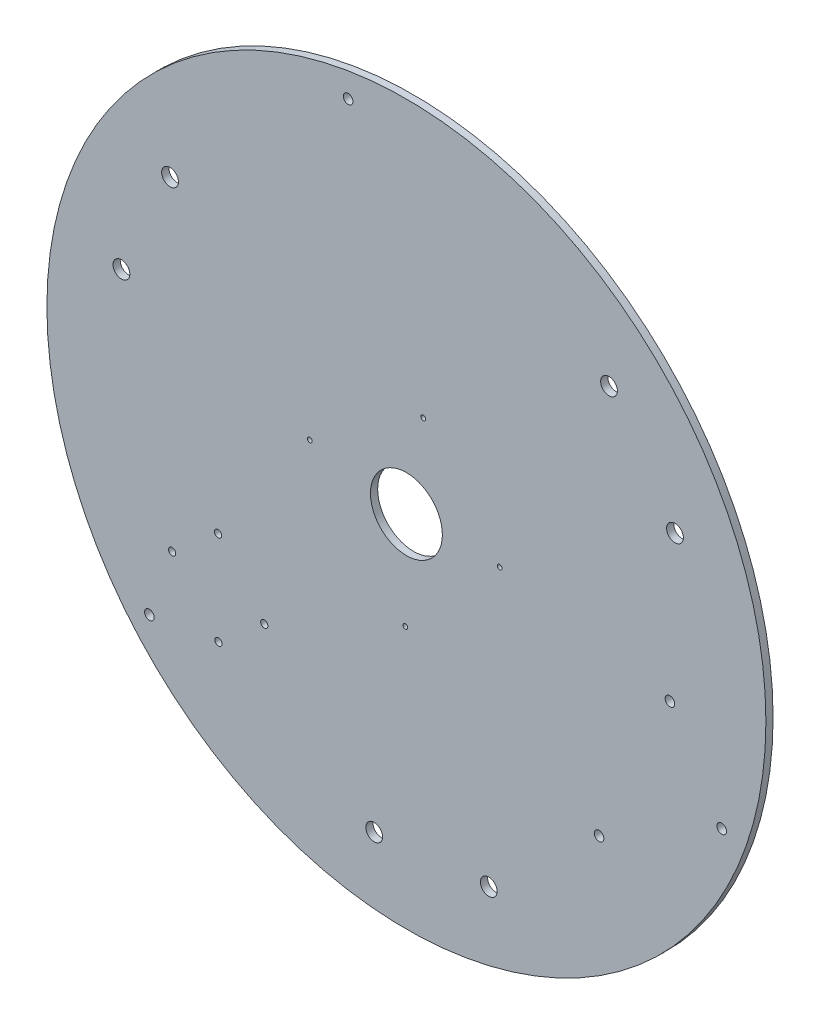
ISO-10303-21;
HEADER;
FILE_DESCRIPTION(('STEP AP214'),'2;1');
FILE_NAME('part.step','',(''),(''),'','','');
FILE_SCHEMA(('AUTOMOTIVE_DESIGN { 1 0 10303 214 1 1 1 1 }'));
ENDSEC;
DATA;
#1=APPLICATION_CONTEXT('core data for automotive mechanical design processes');
#2=APPLICATION_PROTOCOL_DEFINITION('international standard','automotive_design',2000,#1);
#3=PRODUCT_CONTEXT('',#1,'mechanical');
#4=PRODUCT('Part','Part','',(#3));
#5=PRODUCT_RELATED_PRODUCT_CATEGORY('part','',(#4));
#6=PRODUCT_DEFINITION_FORMATION('','',#4);
#7=PRODUCT_DEFINITION_CONTEXT('part definition',#1,'design');
#8=PRODUCT_DEFINITION('design','',#6,#7);
#9=PRODUCT_DEFINITION_SHAPE('','',#8);
#10=(LENGTH_UNIT() NAMED_UNIT(*) SI_UNIT(.MILLI.,.METRE.));
#11=(NAMED_UNIT(*) PLANE_ANGLE_UNIT() SI_UNIT($,.RADIAN.));
#12=(NAMED_UNIT(*) SI_UNIT($,.STERADIAN.) SOLID_ANGLE_UNIT());
#13=UNCERTAINTY_MEASURE_WITH_UNIT(LENGTH_MEASURE(1.E-05),#10,'distance_accuracy_value','');
#14=(GEOMETRIC_REPRESENTATION_CONTEXT(3) GLOBAL_UNCERTAINTY_ASSIGNED_CONTEXT((#13)) GLOBAL_UNIT_ASSIGNED_CONTEXT((#10,
#11,#12)) REPRESENTATION_CONTEXT('',''));
#15=CARTESIAN_POINT('',(0.,0.,0.));
#16=DIRECTION('',(0.,0.,1.));
#17=DIRECTION('',(1.,0.,0.));
#18=AXIS2_PLACEMENT_3D('',#15,#16,#17);
#19=CARTESIAN_POINT('',(0.,0.,3.));
#20=DIRECTION('',(0.,0.,-1.));
#21=DIRECTION('',(-1.,0.,0.));
#22=AXIS2_PLACEMENT_3D('',#19,#20,#21);
#23=CYLINDRICAL_SURFACE('',#22,150.);
#24=CARTESIAN_POINT('',(0.,0.,3.));
#25=DIRECTION('',(0.,0.,1.));
#26=DIRECTION('',(1.,0.,0.));
#27=AXIS2_PLACEMENT_3D('',#24,#25,#26);
#28=CIRCLE('',#27,150.);
#29=CARTESIAN_POINT('',(150.,0.,3.));
#30=VERTEX_POINT('',#29);
#31=EDGE_CURVE('E10',#30,#30,#28,.T.);
#32=ORIENTED_EDGE('',*,*,#31,.F.);
#33=EDGE_LOOP('',(#32));
#34=FACE_BOUND('',#33,.T.);
#35=CARTESIAN_POINT('',(0.,0.,0.));
#36=DIRECTION('',(0.,0.,1.));
#37=DIRECTION('',(1.,0.,0.));
#38=AXIS2_PLACEMENT_3D('',#35,#36,#37);
#39=CIRCLE('',#38,150.);
#40=CARTESIAN_POINT('',(150.,0.,0.));
#41=VERTEX_POINT('',#40);
#42=EDGE_CURVE('E37',#41,#41,#39,.T.);
#43=ORIENTED_EDGE('',*,*,#42,.T.);
#44=EDGE_LOOP('',(#43));
#45=FACE_BOUND('',#44,.T.);
#46=ADVANCED_FACE('F34',(#34,#45),#23,.T.);
#47=CARTESIAN_POINT('',(0.,0.,3.));
#48=DIRECTION('',(0.,0.,1.));
#49=DIRECTION('',(1.,0.,0.));
#50=AXIS2_PLACEMENT_3D('',#47,#48,#49);
#51=PLANE('',#50);
#52=CARTESIAN_POINT('',(-24.3107448733682,137.87308542171,3.));
#53=DIRECTION('',(0.,0.,1.));
#54=DIRECTION('',(1.,0.,0.));
#55=AXIS2_PLACEMENT_3D('',#52,#53,#54);
#56=CIRCLE('',#55,2.);
#57=CARTESIAN_POINT('',(-22.3107448733682,137.87308542171,3.));
#58=VERTEX_POINT('',#57);
#59=EDGE_CURVE('E153',#58,#58,#56,.F.);
#60=ORIENTED_EDGE('',*,*,#59,.T.);
#61=EDGE_LOOP('',(#60));
#62=FACE_BOUND('',#61,.T.);
#63=CARTESIAN_POINT('',(131.556966910026,-47.8828200655963,3.));
#64=DIRECTION('',(0.,0.,1.));
#65=DIRECTION('',(1.,0.,0.));
#66=AXIS2_PLACEMENT_3D('',#63,#64,#65);
#67=CIRCLE('',#66,2.);
#68=CARTESIAN_POINT('',(133.556966910026,-47.8828200655963,3.));
#69=VERTEX_POINT('',#68);
#70=EDGE_CURVE('E154',#69,#69,#67,.F.);
#71=ORIENTED_EDGE('',*,*,#70,.T.);
#72=EDGE_LOOP('',(#71));
#73=FACE_BOUND('',#72,.T.);
#74=CARTESIAN_POINT('',(-107.246222036658,-89.9902653561144,3.));
#75=DIRECTION('',(0.,0.,1.));
#76=DIRECTION('',(1.,0.,0.));
#77=AXIS2_PLACEMENT_3D('',#74,#75,#76);
#78=CIRCLE('',#77,2.);
#79=CARTESIAN_POINT('',(-105.246222036658,-89.9902653561144,3.));
#80=VERTEX_POINT('',#79);
#81=EDGE_CURVE('E131',#80,#80,#78,.F.);
#82=ORIENTED_EDGE('',*,*,#81,.T.);
#83=EDGE_LOOP('',(#82));
#84=FACE_BOUND('',#83,.T.);
#85=CARTESIAN_POINT('',(-59.3021857354107,-69.3415515185726,3.));
#86=DIRECTION('',(0.,0.,1.));
#87=DIRECTION('',(1.,0.,0.));
#88=AXIS2_PLACEMENT_3D('',#85,#86,#87);
#89=CIRCLE('',#88,1.5);
#90=CARTESIAN_POINT('',(-57.8021857354107,-69.3415515185726,3.));
#91=VERTEX_POINT('',#90);
#92=EDGE_CURVE('E107',#91,#91,#89,.F.);
#93=ORIENTED_EDGE('',*,*,#92,.T.);
#94=EDGE_LOOP('',(#93));
#95=FACE_BOUND('',#94,.T.);
#96=CARTESIAN_POINT('',(-78.4532968133853,-85.4112417607359,3.));
#97=DIRECTION('',(0.,0.,1.));
#98=DIRECTION('',(1.,0.,0.));
#99=AXIS2_PLACEMENT_3D('',#96,#97,#98);
#100=CIRCLE('',#99,1.5);
#101=CARTESIAN_POINT('',(-76.9532968133853,-85.4112417607359,3.));
#102=VERTEX_POINT('',#101);
#103=EDGE_CURVE('E135',#102,#102,#100,.F.);
#104=ORIENTED_EDGE('',*,*,#103,.T.);
#105=EDGE_LOOP('',(#104));
#106=FACE_BOUND('',#105,.T.);
#107=CARTESIAN_POINT('',(-97.7369251039812,-62.4299084671663,3.));
#108=DIRECTION('',(0.,0.,1.));
#109=DIRECTION('',(1.,0.,0.));
#110=AXIS2_PLACEMENT_3D('',#107,#108,#109);
#111=CIRCLE('',#110,1.5);
#112=CARTESIAN_POINT('',(-96.2369251039812,-62.4299084671663,3.));
#113=VERTEX_POINT('',#112);
#114=EDGE_CURVE('E127',#113,#113,#111,.F.);
#115=ORIENTED_EDGE('',*,*,#114,.T.);
#116=EDGE_LOOP('',(#115));
#117=FACE_BOUND('',#116,.T.);
#118=CARTESIAN_POINT('',(-78.5858140260066,-46.3602182250031,3.));
#119=DIRECTION('',(0.,0.,1.));
#120=DIRECTION('',(1.,0.,0.));
#121=AXIS2_PLACEMENT_3D('',#118,#119,#120);
#122=CIRCLE('',#121,1.5);
#123=CARTESIAN_POINT('',(-77.0858140260066,-46.3602182250031,3.));
#124=VERTEX_POINT('',#123);
#125=EDGE_CURVE('E128',#124,#124,#122,.F.);
#126=ORIENTED_EDGE('',*,*,#125,.T.);
#127=EDGE_LOOP('',(#126));
#128=FACE_BOUND('',#127,.T.);
#129=CARTESIAN_POINT('',(-0.451473382715277,-40.846457118223,3.));
#130=DIRECTION('',(0.,0.,1.));
#131=DIRECTION('',(1.,0.,0.));
#132=AXIS2_PLACEMENT_3D('',#129,#130,#131);
#133=CIRCLE('',#132,1.);
#134=CARTESIAN_POINT('',(0.548526617284725,-40.846457118223,3.));
#135=VERTEX_POINT('',#134);
#136=EDGE_CURVE('E99',#135,#135,#133,.F.);
#137=ORIENTED_EDGE('',*,*,#136,.T.);
#138=EDGE_LOOP('',(#137));
#139=FACE_BOUND('',#138,.T.);
#140=CARTESIAN_POINT('',(38.9224660137955,0.285726101245103,3.));
#141=DIRECTION('',(0.,0.,1.));
#142=DIRECTION('',(1.,0.,0.));
#143=AXIS2_PLACEMENT_3D('',#140,#141,#142);
#144=CIRCLE('',#143,0.999999999999998);
#145=CARTESIAN_POINT('',(39.9224660137955,0.285726101245103,3.));
#146=VERTEX_POINT('',#145);
#147=EDGE_CURVE('E111',#146,#146,#144,.F.);
#148=ORIENTED_EDGE('',*,*,#147,.T.);
#149=EDGE_LOOP('',(#148));
#150=FACE_BOUND('',#149,.T.);
#151=CARTESIAN_POINT('',(-40.3043051832802,6.64829835515404,3.));
#152=DIRECTION('',(0.,0.,1.));
#153=DIRECTION('',(1.,0.,0.));
#154=AXIS2_PLACEMENT_3D('',#151,#152,#153);
#155=CIRCLE('',#154,0.999999999999998);
#156=CARTESIAN_POINT('',(-39.3043051832802,6.64829835515404,3.));
#157=VERTEX_POINT('',#156);
#158=EDGE_CURVE('E103',#157,#157,#155,.F.);
#159=ORIENTED_EDGE('',*,*,#158,.T.);
#160=EDGE_LOOP('',(#159));
#161=FACE_BOUND('',#160,.T.);
#162=CARTESIAN_POINT('',(7.04020057334357,38.2815304799468,3.));
#163=DIRECTION('',(0.,0.,1.));
#164=DIRECTION('',(1.,0.,0.));
#165=AXIS2_PLACEMENT_3D('',#162,#163,#164);
#166=CIRCLE('',#165,1.);
#167=CARTESIAN_POINT('',(8.04020057334357,38.2815304799468,3.));
#168=VERTEX_POINT('',#167);
#169=EDGE_CURVE('E104',#168,#168,#166,.F.);
#170=ORIENTED_EDGE('',*,*,#169,.T.);
#171=EDGE_LOOP('',(#170));
#172=FACE_BOUND('',#171,.T.);
#173=CARTESIAN_POINT('',(0.,0.,3.));
#174=DIRECTION('',(0.,0.,1.));
#175=DIRECTION('',(1.,0.,0.));
#176=AXIS2_PLACEMENT_3D('',#173,#174,#175);
#177=CIRCLE('',#176,15.);
#178=CARTESIAN_POINT('',(15.,0.,3.));
#179=VERTEX_POINT('',#178);
#180=EDGE_CURVE('E89',#179,#179,#177,.F.);
#181=ORIENTED_EDGE('',*,*,#180,.T.);
#182=EDGE_LOOP('',(#181));
#183=FACE_BOUND('',#182,.T.);
#184=CARTESIAN_POINT('',(109.953956799773,-12.6541449364913,3.));
#185=DIRECTION('',(0.,0.,1.));
#186=DIRECTION('',(1.,0.,0.));
#187=AXIS2_PLACEMENT_3D('',#184,#185,#186);
#188=CIRCLE('',#187,2.);
#189=CARTESIAN_POINT('',(111.953956799773,-12.6541449364913,3.));
#190=VERTEX_POINT('',#189);
#191=EDGE_CURVE('E65',#190,#190,#188,.F.);
#192=ORIENTED_EDGE('',*,*,#191,.T.);
#193=EDGE_LOOP('',(#192));
#194=FACE_BOUND('',#193,.T.);
#195=CARTESIAN_POINT('',(80.3706784779234,-76.0956900290566,3.));
#196=DIRECTION('',(0.,0.,1.));
#197=DIRECTION('',(1.,0.,0.));
#198=AXIS2_PLACEMENT_3D('',#195,#196,#197);
#199=CIRCLE('',#198,2.);
#200=CARTESIAN_POINT('',(82.3706784779234,-76.0956900290566,3.));
#201=VERTEX_POINT('',#200);
#202=EDGE_CURVE('E86',#201,#201,#199,.F.);
#203=ORIENTED_EDGE('',*,*,#202,.T.);
#204=EDGE_LOOP('',(#203));
#205=FACE_BOUND('',#204,.T.);
#206=CARTESIAN_POINT('',(34.3673618839201,-117.451625945066,3.));
#207=DIRECTION('',(0.,0.,1.));
#208=DIRECTION('',(1.,0.,0.));
#209=AXIS2_PLACEMENT_3D('',#206,#207,#208);
#210=CIRCLE('',#209,3.50000000000001);
#211=CARTESIAN_POINT('',(37.8673618839201,-117.451625945066,3.));
#212=VERTEX_POINT('',#211);
#213=EDGE_CURVE('E53',#212,#212,#210,.F.);
#214=ORIENTED_EDGE('',*,*,#213,.T.);
#215=EDGE_LOOP('',(#214));
#216=FACE_BOUND('',#215,.T.);
#217=CARTESIAN_POINT('',(-13.4499836244839,-121.635101596953,3.));
#218=DIRECTION('',(0.,0.,1.));
#219=DIRECTION('',(1.,0.,0.));
#220=AXIS2_PLACEMENT_3D('',#217,#218,#219);
#221=CIRCLE('',#220,3.50000000000002);
#222=CARTESIAN_POINT('',(-9.94998362448386,-121.635101596953,3.));
#223=VERTEX_POINT('',#222);
#224=EDGE_CURVE('E72',#223,#223,#221,.F.);
#225=ORIENTED_EDGE('',*,*,#224,.T.);
#226=EDGE_LOOP('',(#225));
#227=FACE_BOUND('',#226,.T.);
#228=CARTESIAN_POINT('',(-118.899772726174,28.9628045200057,3.));
#229=DIRECTION('',(0.,0.,1.));
#230=DIRECTION('',(1.,0.,0.));
#231=AXIS2_PLACEMENT_3D('',#228,#229,#230);
#232=CIRCLE('',#231,3.50000000000001);
#233=CARTESIAN_POINT('',(-115.399772726174,28.9628045200057,3.));
#234=VERTEX_POINT('',#233);
#235=EDGE_CURVE('E66',#234,#234,#232,.F.);
#236=ORIENTED_EDGE('',*,*,#235,.T.);
#237=EDGE_LOOP('',(#236));
#238=FACE_BOUND('',#237,.T.);
#239=CARTESIAN_POINT('',(-98.6140961626203,72.4655782977648,3.));
#240=DIRECTION('',(0.,0.,1.));
#241=DIRECTION('',(1.,0.,0.));
#242=AXIS2_PLACEMENT_3D('',#239,#240,#241);
#243=CIRCLE('',#242,3.50000000000002);
#244=CARTESIAN_POINT('',(-95.1140961626203,72.4655782977648,3.));
#245=VERTEX_POINT('',#244);
#246=EDGE_CURVE('E58',#245,#245,#243,.F.);
#247=ORIENTED_EDGE('',*,*,#246,.T.);
#248=EDGE_LOOP('',(#247));
#249=FACE_BOUND('',#248,.T.);
#250=CARTESIAN_POINT('',(84.5324108422541,88.4888214250612,3.));
#251=DIRECTION('',(0.,0.,1.));
#252=DIRECTION('',(1.,0.,0.));
#253=AXIS2_PLACEMENT_3D('',#250,#251,#252);
#254=CIRCLE('',#253,3.50000000000001);
#255=CARTESIAN_POINT('',(88.0324108422541,88.4888214250612,3.));
#256=VERTEX_POINT('',#255);
#257=EDGE_CURVE('E44',#256,#256,#254,.F.);
#258=ORIENTED_EDGE('',*,*,#257,.T.);
#259=EDGE_LOOP('',(#258));
#260=FACE_BOUND('',#259,.T.);
#261=CARTESIAN_POINT('',(112.064079787104,49.1695232991894,3.));
#262=DIRECTION('',(0.,0.,1.));
#263=DIRECTION('',(1.,0.,0.));
#264=AXIS2_PLACEMENT_3D('',#261,#262,#263);
#265=CIRCLE('',#264,3.50000000000002);
#266=CARTESIAN_POINT('',(115.564079787104,49.1695232991894,3.));
#267=VERTEX_POINT('',#266);
#268=EDGE_CURVE('E50',#267,#267,#265,.F.);
#269=ORIENTED_EDGE('',*,*,#268,.T.);
#270=EDGE_LOOP('',(#269));
#271=FACE_BOUND('',#270,.T.);
#272=ORIENTED_EDGE('',*,*,#31,.T.);
#273=EDGE_LOOP('',(#272));
#274=FACE_BOUND('',#273,.T.);
#275=ADVANCED_FACE('F173',(#62,#73,#84,#95,#106,#117,#128,#139,#150,#161,#172,#183,#194,#205,
#216,#227,#238,#249,#260,#271,#274),#51,.T.);
#276=CARTESIAN_POINT('',(0.,0.,0.));
#277=DIRECTION('',(0.,0.,1.));
#278=DIRECTION('',(1.,0.,0.));
#279=AXIS2_PLACEMENT_3D('',#276,#277,#278);
#280=PLANE('',#279);
#281=CARTESIAN_POINT('',(-24.3107448733682,137.87308542171,0.));
#282=DIRECTION('',(0.,0.,-1.));
#283=DIRECTION('',(0.500000000000004,0.866025403784436,0.));
#284=AXIS2_PLACEMENT_3D('',#281,#282,#283);
#285=CIRCLE('',#284,2.);
#286=CARTESIAN_POINT('',(-23.3107448733682,139.605136229278,0.));
#287=VERTEX_POINT('',#286);
#288=EDGE_CURVE('E157',#287,#287,#285,.T.);
#289=ORIENTED_EDGE('',*,*,#288,.F.);
#290=EDGE_LOOP('',(#289));
#291=FACE_BOUND('',#290,.T.);
#292=CARTESIAN_POINT('',(131.556966910026,-47.8828200655963,0.));
#293=DIRECTION('',(0.,0.,-1.));
#294=DIRECTION('',(0.499999999999992,-0.866025403784443,0.));
#295=AXIS2_PLACEMENT_3D('',#292,#293,#294);
#296=CIRCLE('',#295,2.);
#297=CARTESIAN_POINT('',(132.556966910026,-49.6148708731651,0.));
#298=VERTEX_POINT('',#297);
#299=EDGE_CURVE('E158',#298,#298,#296,.T.);
#300=ORIENTED_EDGE('',*,*,#299,.F.);
#301=EDGE_LOOP('',(#300));
#302=FACE_BOUND('',#301,.T.);
#303=CARTESIAN_POINT('',(-107.246222036658,-89.9902653561144,0.));
#304=DIRECTION('',(0.,0.,-1.));
#305=DIRECTION('',(-1.,0.,0.));
#306=AXIS2_PLACEMENT_3D('',#303,#304,#305);
#307=CIRCLE('',#306,2.);
#308=CARTESIAN_POINT('',(-109.246222036658,-89.9902653561144,0.));
#309=VERTEX_POINT('',#308);
#310=EDGE_CURVE('E150',#309,#309,#307,.T.);
#311=ORIENTED_EDGE('',*,*,#310,.F.);
#312=EDGE_LOOP('',(#311));
#313=FACE_BOUND('',#312,.T.);
#314=CARTESIAN_POINT('',(-59.3021857354107,-69.3415515185726,0.));
#315=DIRECTION('',(0.,0.,-1.));
#316=DIRECTION('',(-1.,0.,0.));
#317=AXIS2_PLACEMENT_3D('',#314,#315,#316);
#318=CIRCLE('',#317,1.5);
#319=CARTESIAN_POINT('',(-60.8021857354107,-69.3415515185726,0.));
#320=VERTEX_POINT('',#319);
#321=EDGE_CURVE('E141',#320,#320,#318,.T.);
#322=ORIENTED_EDGE('',*,*,#321,.F.);
#323=EDGE_LOOP('',(#322));
#324=FACE_BOUND('',#323,.T.);
#325=CARTESIAN_POINT('',(-78.4532968133853,-85.4112417607359,0.));
#326=DIRECTION('',(0.,0.,-1.));
#327=DIRECTION('',(-1.,0.,0.));
#328=AXIS2_PLACEMENT_3D('',#325,#326,#327);
#329=CIRCLE('',#328,1.5);
#330=CARTESIAN_POINT('',(-79.9532968133853,-85.4112417607359,0.));
#331=VERTEX_POINT('',#330);
#332=EDGE_CURVE('E138',#331,#331,#329,.T.);
#333=ORIENTED_EDGE('',*,*,#332,.F.);
#334=EDGE_LOOP('',(#333));
#335=FACE_BOUND('',#334,.T.);
#336=CARTESIAN_POINT('',(-97.7369251039812,-62.4299084671663,0.));
#337=DIRECTION('',(0.,0.,-1.));
#338=DIRECTION('',(-1.,0.,0.));
#339=AXIS2_PLACEMENT_3D('',#336,#337,#338);
#340=CIRCLE('',#339,1.5);
#341=CARTESIAN_POINT('',(-99.2369251039812,-62.4299084671663,0.));
#342=VERTEX_POINT('',#341);
#343=EDGE_CURVE('E132',#342,#342,#340,.T.);
#344=ORIENTED_EDGE('',*,*,#343,.F.);
#345=EDGE_LOOP('',(#344));
#346=FACE_BOUND('',#345,.T.);
#347=CARTESIAN_POINT('',(-78.5858140260066,-46.3602182250031,0.));
#348=DIRECTION('',(0.,0.,-1.));
#349=DIRECTION('',(-1.,0.,0.));
#350=AXIS2_PLACEMENT_3D('',#347,#348,#349);
#351=CIRCLE('',#350,1.5);
#352=CARTESIAN_POINT('',(-80.0858140260066,-46.3602182250031,0.));
#353=VERTEX_POINT('',#352);
#354=EDGE_CURVE('E124',#353,#353,#351,.T.);
#355=ORIENTED_EDGE('',*,*,#354,.F.);
#356=EDGE_LOOP('',(#355));
#357=FACE_BOUND('',#356,.T.);
#358=CARTESIAN_POINT('',(-0.451473382715277,-40.846457118223,0.));
#359=DIRECTION('',(0.,0.,-1.));
#360=DIRECTION('',(-1.,0.,0.));
#361=AXIS2_PLACEMENT_3D('',#358,#359,#360);
#362=CIRCLE('',#361,1.);
#363=CARTESIAN_POINT('',(-1.45147338271528,-40.846457118223,0.));
#364=VERTEX_POINT('',#363);
#365=EDGE_CURVE('E117',#364,#364,#362,.T.);
#366=ORIENTED_EDGE('',*,*,#365,.F.);
#367=EDGE_LOOP('',(#366));
#368=FACE_BOUND('',#367,.T.);
#369=CARTESIAN_POINT('',(38.9224660137955,0.285726101245103,0.));
#370=DIRECTION('',(0.,0.,-1.));
#371=DIRECTION('',(-1.,0.,0.));
#372=AXIS2_PLACEMENT_3D('',#369,#370,#371);
#373=CIRCLE('',#372,0.999999999999998);
#374=CARTESIAN_POINT('',(37.9224660137955,0.285726101245103,0.));
#375=VERTEX_POINT('',#374);
#376=EDGE_CURVE('E114',#375,#375,#373,.T.);
#377=ORIENTED_EDGE('',*,*,#376,.F.);
#378=EDGE_LOOP('',(#377));
#379=FACE_BOUND('',#378,.T.);
#380=CARTESIAN_POINT('',(-40.3043051832802,6.64829835515404,0.));
#381=DIRECTION('',(0.,0.,-1.));
#382=DIRECTION('',(-1.,0.,0.));
#383=AXIS2_PLACEMENT_3D('',#380,#381,#382);
#384=CIRCLE('',#383,0.999999999999998);
#385=CARTESIAN_POINT('',(-41.3043051832802,6.64829835515404,0.));
#386=VERTEX_POINT('',#385);
#387=EDGE_CURVE('E108',#386,#386,#384,.T.);
#388=ORIENTED_EDGE('',*,*,#387,.F.);
#389=EDGE_LOOP('',(#388));
#390=FACE_BOUND('',#389,.T.);
#391=CARTESIAN_POINT('',(7.04020057334357,38.2815304799468,0.));
#392=DIRECTION('',(0.,0.,-1.));
#393=DIRECTION('',(-1.,0.,0.));
#394=AXIS2_PLACEMENT_3D('',#391,#392,#393);
#395=CIRCLE('',#394,1.);
#396=CARTESIAN_POINT('',(6.04020057334357,38.2815304799468,0.));
#397=VERTEX_POINT('',#396);
#398=EDGE_CURVE('E100',#397,#397,#395,.T.);
#399=ORIENTED_EDGE('',*,*,#398,.F.);
#400=EDGE_LOOP('',(#399));
#401=FACE_BOUND('',#400,.T.);
#402=CARTESIAN_POINT('',(0.,0.,0.));
#403=DIRECTION('',(0.,0.,-1.));
#404=DIRECTION('',(-1.,0.,0.));
#405=AXIS2_PLACEMENT_3D('',#402,#403,#404);
#406=CIRCLE('',#405,15.);
#407=CARTESIAN_POINT('',(-15.,0.,0.));
#408=VERTEX_POINT('',#407);
#409=EDGE_CURVE('E96',#408,#408,#406,.T.);
#410=ORIENTED_EDGE('',*,*,#409,.F.);
#411=EDGE_LOOP('',(#410));
#412=FACE_BOUND('',#411,.T.);
#413=CARTESIAN_POINT('',(109.953956799773,-12.6541449364913,0.));
#414=DIRECTION('',(0.,0.,-1.));
#415=DIRECTION('',(-1.,0.,0.));
#416=AXIS2_PLACEMENT_3D('',#413,#414,#415);
#417=CIRCLE('',#416,2.);
#418=CARTESIAN_POINT('',(107.953956799773,-12.6541449364913,0.));
#419=VERTEX_POINT('',#418);
#420=EDGE_CURVE('E85',#419,#419,#417,.T.);
#421=ORIENTED_EDGE('',*,*,#420,.F.);
#422=EDGE_LOOP('',(#421));
#423=FACE_BOUND('',#422,.T.);
#424=CARTESIAN_POINT('',(80.3706784779234,-76.0956900290566,0.));
#425=DIRECTION('',(0.,0.,-1.));
#426=DIRECTION('',(-1.,0.,0.));
#427=AXIS2_PLACEMENT_3D('',#424,#425,#426);
#428=CIRCLE('',#427,2.);
#429=CARTESIAN_POINT('',(78.3706784779234,-76.0956900290566,0.));
#430=VERTEX_POINT('',#429);
#431=EDGE_CURVE('E82',#430,#430,#428,.T.);
#432=ORIENTED_EDGE('',*,*,#431,.F.);
#433=EDGE_LOOP('',(#432));
#434=FACE_BOUND('',#433,.T.);
#435=CARTESIAN_POINT('',(34.3673618839201,-117.451625945066,0.));
#436=DIRECTION('',(0.,0.,-1.));
#437=DIRECTION('',(0.500000000000004,0.866025403784436,0.));
#438=AXIS2_PLACEMENT_3D('',#435,#436,#437);
#439=CIRCLE('',#438,3.50000000000001);
#440=CARTESIAN_POINT('',(36.1173618839201,-114.42053703182,0.));
#441=VERTEX_POINT('',#440);
#442=EDGE_CURVE('E75',#441,#441,#439,.T.);
#443=ORIENTED_EDGE('',*,*,#442,.F.);
#444=EDGE_LOOP('',(#443));
#445=FACE_BOUND('',#444,.T.);
#446=CARTESIAN_POINT('',(-13.4499836244839,-121.635101596953,0.));
#447=DIRECTION('',(0.,0.,-1.));
#448=DIRECTION('',(-0.500000000000004,-0.866025403784436,0.));
#449=AXIS2_PLACEMENT_3D('',#446,#447,#448);
#450=CIRCLE('',#449,3.50000000000002);
#451=CARTESIAN_POINT('',(-15.1999836244839,-124.666190510199,0.));
#452=VERTEX_POINT('',#451);
#453=EDGE_CURVE('E69',#452,#452,#450,.T.);
#454=ORIENTED_EDGE('',*,*,#453,.F.);
#455=EDGE_LOOP('',(#454));
#456=FACE_BOUND('',#455,.T.);
#457=CARTESIAN_POINT('',(-118.899772726174,28.9628045200057,0.));
#458=DIRECTION('',(0.,0.,-1.));
#459=DIRECTION('',(0.499999999999992,-0.866025403784443,0.));
#460=AXIS2_PLACEMENT_3D('',#457,#458,#459);
#461=CIRCLE('',#460,3.50000000000001);
#462=CARTESIAN_POINT('',(-117.149772726174,25.9317156067601,0.));
#463=VERTEX_POINT('',#462);
#464=EDGE_CURVE('E61',#463,#463,#461,.T.);
#465=ORIENTED_EDGE('',*,*,#464,.F.);
#466=EDGE_LOOP('',(#465));
#467=FACE_BOUND('',#466,.T.);
#468=CARTESIAN_POINT('',(-98.6140961626203,72.4655782977648,0.));
#469=DIRECTION('',(0.,0.,-1.));
#470=DIRECTION('',(-0.499999999999992,0.866025403784443,0.));
#471=AXIS2_PLACEMENT_3D('',#468,#469,#470);
#472=CIRCLE('',#471,3.50000000000002);
#473=CARTESIAN_POINT('',(-100.36409616262,75.4966672110103,0.));
#474=VERTEX_POINT('',#473);
#475=EDGE_CURVE('E62',#474,#474,#472,.T.);
#476=ORIENTED_EDGE('',*,*,#475,.F.);
#477=EDGE_LOOP('',(#476));
#478=FACE_BOUND('',#477,.T.);
#479=CARTESIAN_POINT('',(84.5324108422541,88.4888214250612,0.));
#480=DIRECTION('',(0.,0.,-1.));
#481=DIRECTION('',(-1.,0.,0.));
#482=AXIS2_PLACEMENT_3D('',#479,#480,#481);
#483=CIRCLE('',#482,3.50000000000001);
#484=CARTESIAN_POINT('',(81.0324108422541,88.4888214250612,0.));
#485=VERTEX_POINT('',#484);
#486=EDGE_CURVE('E49',#485,#485,#483,.T.);
#487=ORIENTED_EDGE('',*,*,#486,.F.);
#488=EDGE_LOOP('',(#487));
#489=FACE_BOUND('',#488,.T.);
#490=CARTESIAN_POINT('',(112.064079787104,49.1695232991894,0.));
#491=DIRECTION('',(0.,0.,-1.));
#492=DIRECTION('',(1.,0.,0.));
#493=AXIS2_PLACEMENT_3D('',#490,#491,#492);
#494=CIRCLE('',#493,3.50000000000002);
#495=CARTESIAN_POINT('',(115.564079787104,49.1695232991894,0.));
#496=VERTEX_POINT('',#495);
#497=EDGE_CURVE('E46',#496,#496,#494,.T.);
#498=ORIENTED_EDGE('',*,*,#497,.F.);
#499=EDGE_LOOP('',(#498));
#500=FACE_BOUND('',#499,.T.);
#501=ORIENTED_EDGE('',*,*,#42,.F.);
#502=EDGE_LOOP('',(#501));
#503=FACE_BOUND('',#502,.T.);
#504=ADVANCED_FACE('F169',(#291,#302,#313,#324,#335,#346,#357,#368,#379,#390,#401,#412,#423,
#434,#445,#456,#467,#478,#489,#500,#503),#280,.F.);
#505=CARTESIAN_POINT('',(112.064079787104,49.1695232991894,12.8994949366117));
#506=DIRECTION('',(0.,0.,-1.));
#507=DIRECTION('',(-1.,0.,0.));
#508=AXIS2_PLACEMENT_3D('',#505,#506,#507);
#509=CYLINDRICAL_SURFACE('',#508,3.50000000000002);
#510=ORIENTED_EDGE('',*,*,#497,.T.);
#511=EDGE_LOOP('',(#510));
#512=FACE_BOUND('',#511,.T.);
#513=ORIENTED_EDGE('',*,*,#268,.F.);
#514=EDGE_LOOP('',(#513));
#515=FACE_BOUND('',#514,.T.);
#516=ADVANCED_FACE('F172',(#512,#515),#509,.F.);
#517=CARTESIAN_POINT('',(84.5324108422541,88.4888214250612,12.8994949366117));
#518=DIRECTION('',(0.,0.,-1.));
#519=DIRECTION('',(-1.,0.,0.));
#520=AXIS2_PLACEMENT_3D('',#517,#518,#519);
#521=CYLINDRICAL_SURFACE('',#520,3.50000000000001);
#522=ORIENTED_EDGE('',*,*,#486,.T.);
#523=EDGE_LOOP('',(#522));
#524=FACE_BOUND('',#523,.T.);
#525=ORIENTED_EDGE('',*,*,#257,.F.);
#526=EDGE_LOOP('',(#525));
#527=FACE_BOUND('',#526,.T.);
#528=ADVANCED_FACE('F228',(#524,#527),#521,.F.);
#529=CARTESIAN_POINT('',(-98.6140961626203,72.4655782977648,12.8994949366117));
#530=DIRECTION('',(0.,0.,-1.));
#531=DIRECTION('',(-1.,0.,0.));
#532=AXIS2_PLACEMENT_3D('',#529,#530,#531);
#533=CYLINDRICAL_SURFACE('',#532,3.50000000000002);
#534=ORIENTED_EDGE('',*,*,#475,.T.);
#535=EDGE_LOOP('',(#534));
#536=FACE_BOUND('',#535,.T.);
#537=ORIENTED_EDGE('',*,*,#246,.F.);
#538=EDGE_LOOP('',(#537));
#539=FACE_BOUND('',#538,.T.);
#540=ADVANCED_FACE('F232',(#536,#539),#533,.F.);
#541=CARTESIAN_POINT('',(-118.899772726174,28.9628045200057,12.8994949366117));
#542=DIRECTION('',(0.,0.,-1.));
#543=DIRECTION('',(-1.,0.,0.));
#544=AXIS2_PLACEMENT_3D('',#541,#542,#543);
#545=CYLINDRICAL_SURFACE('',#544,3.50000000000001);
#546=ORIENTED_EDGE('',*,*,#464,.T.);
#547=EDGE_LOOP('',(#546));
#548=FACE_BOUND('',#547,.T.);
#549=ORIENTED_EDGE('',*,*,#235,.F.);
#550=EDGE_LOOP('',(#549));
#551=FACE_BOUND('',#550,.T.);
#552=ADVANCED_FACE('F236',(#548,#551),#545,.F.);
#553=CARTESIAN_POINT('',(-13.4499836244839,-121.635101596953,12.8994949366117));
#554=DIRECTION('',(0.,0.,-1.));
#555=DIRECTION('',(-1.,0.,0.));
#556=AXIS2_PLACEMENT_3D('',#553,#554,#555);
#557=CYLINDRICAL_SURFACE('',#556,3.50000000000002);
#558=ORIENTED_EDGE('',*,*,#453,.T.);
#559=EDGE_LOOP('',(#558));
#560=FACE_BOUND('',#559,.T.);
#561=ORIENTED_EDGE('',*,*,#224,.F.);
#562=EDGE_LOOP('',(#561));
#563=FACE_BOUND('',#562,.T.);
#564=ADVANCED_FACE('F240',(#560,#563),#557,.F.);
#565=CARTESIAN_POINT('',(34.3673618839201,-117.451625945066,12.8994949366117));
#566=DIRECTION('',(0.,0.,-1.));
#567=DIRECTION('',(-1.,0.,0.));
#568=AXIS2_PLACEMENT_3D('',#565,#566,#567);
#569=CYLINDRICAL_SURFACE('',#568,3.50000000000001);
#570=ORIENTED_EDGE('',*,*,#442,.T.);
#571=EDGE_LOOP('',(#570));
#572=FACE_BOUND('',#571,.T.);
#573=ORIENTED_EDGE('',*,*,#213,.F.);
#574=EDGE_LOOP('',(#573));
#575=FACE_BOUND('',#574,.T.);
#576=ADVANCED_FACE('F244',(#572,#575),#569,.F.);
#577=CARTESIAN_POINT('',(80.3706784779234,-76.0956900290566,8.65685424949239));
#578=DIRECTION('',(0.,0.,-1.));
#579=DIRECTION('',(-1.,0.,0.));
#580=AXIS2_PLACEMENT_3D('',#577,#578,#579);
#581=CYLINDRICAL_SURFACE('',#580,2.);
#582=ORIENTED_EDGE('',*,*,#431,.T.);
#583=EDGE_LOOP('',(#582));
#584=FACE_BOUND('',#583,.T.);
#585=ORIENTED_EDGE('',*,*,#202,.F.);
#586=EDGE_LOOP('',(#585));
#587=FACE_BOUND('',#586,.T.);
#588=ADVANCED_FACE('F248',(#584,#587),#581,.F.);
#589=CARTESIAN_POINT('',(109.953956799773,-12.6541449364913,8.65685424949239));
#590=DIRECTION('',(0.,0.,-1.));
#591=DIRECTION('',(-1.,0.,0.));
#592=AXIS2_PLACEMENT_3D('',#589,#590,#591);
#593=CYLINDRICAL_SURFACE('',#592,2.);
#594=ORIENTED_EDGE('',*,*,#420,.T.);
#595=EDGE_LOOP('',(#594));
#596=FACE_BOUND('',#595,.T.);
#597=ORIENTED_EDGE('',*,*,#191,.F.);
#598=EDGE_LOOP('',(#597));
#599=FACE_BOUND('',#598,.T.);
#600=ADVANCED_FACE('F252',(#596,#599),#593,.F.);
#601=CARTESIAN_POINT('',(0.,0.,45.4264068711929));
#602=DIRECTION('',(0.,0.,-1.));
#603=DIRECTION('',(-1.,0.,0.));
#604=AXIS2_PLACEMENT_3D('',#601,#602,#603);
#605=CYLINDRICAL_SURFACE('',#604,15.);
#606=ORIENTED_EDGE('',*,*,#409,.T.);
#607=EDGE_LOOP('',(#606));
#608=FACE_BOUND('',#607,.T.);
#609=ORIENTED_EDGE('',*,*,#180,.F.);
#610=EDGE_LOOP('',(#609));
#611=FACE_BOUND('',#610,.T.);
#612=ADVANCED_FACE('F256',(#608,#611),#605,.F.);
#613=CARTESIAN_POINT('',(7.04020057334357,38.2815304799468,5.8284271247462));
#614=DIRECTION('',(0.,0.,-1.));
#615=DIRECTION('',(-1.,0.,0.));
#616=AXIS2_PLACEMENT_3D('',#613,#614,#615);
#617=CYLINDRICAL_SURFACE('',#616,1.);
#618=ORIENTED_EDGE('',*,*,#398,.T.);
#619=EDGE_LOOP('',(#618));
#620=FACE_BOUND('',#619,.T.);
#621=ORIENTED_EDGE('',*,*,#169,.F.);
#622=EDGE_LOOP('',(#621));
#623=FACE_BOUND('',#622,.T.);
#624=ADVANCED_FACE('F260',(#620,#623),#617,.F.);
#625=CARTESIAN_POINT('',(-40.3043051832802,6.64829835515404,5.8284271247462));
#626=DIRECTION('',(0.,0.,-1.));
#627=DIRECTION('',(-1.,0.,0.));
#628=AXIS2_PLACEMENT_3D('',#625,#626,#627);
#629=CYLINDRICAL_SURFACE('',#628,0.999999999999998);
#630=ORIENTED_EDGE('',*,*,#387,.T.);
#631=EDGE_LOOP('',(#630));
#632=FACE_BOUND('',#631,.T.);
#633=ORIENTED_EDGE('',*,*,#158,.F.);
#634=EDGE_LOOP('',(#633));
#635=FACE_BOUND('',#634,.T.);
#636=ADVANCED_FACE('F264',(#632,#635),#629,.F.);
#637=CARTESIAN_POINT('',(38.9224660137955,0.285726101245103,5.8284271247462));
#638=DIRECTION('',(0.,0.,-1.));
#639=DIRECTION('',(-1.,0.,0.));
#640=AXIS2_PLACEMENT_3D('',#637,#638,#639);
#641=CYLINDRICAL_SURFACE('',#640,0.999999999999998);
#642=ORIENTED_EDGE('',*,*,#376,.T.);
#643=EDGE_LOOP('',(#642));
#644=FACE_BOUND('',#643,.T.);
#645=ORIENTED_EDGE('',*,*,#147,.F.);
#646=EDGE_LOOP('',(#645));
#647=FACE_BOUND('',#646,.T.);
#648=ADVANCED_FACE('F268',(#644,#647),#641,.F.);
#649=CARTESIAN_POINT('',(-0.451473382715277,-40.846457118223,5.8284271247462));
#650=DIRECTION('',(0.,0.,-1.));
#651=DIRECTION('',(-1.,0.,0.));
#652=AXIS2_PLACEMENT_3D('',#649,#650,#651);
#653=CYLINDRICAL_SURFACE('',#652,1.);
#654=ORIENTED_EDGE('',*,*,#365,.T.);
#655=EDGE_LOOP('',(#654));
#656=FACE_BOUND('',#655,.T.);
#657=ORIENTED_EDGE('',*,*,#136,.F.);
#658=EDGE_LOOP('',(#657));
#659=FACE_BOUND('',#658,.T.);
#660=ADVANCED_FACE('F272',(#656,#659),#653,.F.);
#661=CARTESIAN_POINT('',(-78.5858140260066,-46.3602182250031,7.24264068711929));
#662=DIRECTION('',(0.,0.,-1.));
#663=DIRECTION('',(-1.,0.,0.));
#664=AXIS2_PLACEMENT_3D('',#661,#662,#663);
#665=CYLINDRICAL_SURFACE('',#664,1.5);
#666=ORIENTED_EDGE('',*,*,#354,.T.);
#667=EDGE_LOOP('',(#666));
#668=FACE_BOUND('',#667,.T.);
#669=ORIENTED_EDGE('',*,*,#125,.F.);
#670=EDGE_LOOP('',(#669));
#671=FACE_BOUND('',#670,.T.);
#672=ADVANCED_FACE('F276',(#668,#671),#665,.F.);
#673=CARTESIAN_POINT('',(-97.7369251039812,-62.4299084671663,7.24264068711929));
#674=DIRECTION('',(0.,0.,-1.));
#675=DIRECTION('',(-1.,0.,0.));
#676=AXIS2_PLACEMENT_3D('',#673,#674,#675);
#677=CYLINDRICAL_SURFACE('',#676,1.5);
#678=ORIENTED_EDGE('',*,*,#343,.T.);
#679=EDGE_LOOP('',(#678));
#680=FACE_BOUND('',#679,.T.);
#681=ORIENTED_EDGE('',*,*,#114,.F.);
#682=EDGE_LOOP('',(#681));
#683=FACE_BOUND('',#682,.T.);
#684=ADVANCED_FACE('F280',(#680,#683),#677,.F.);
#685=CARTESIAN_POINT('',(-78.4532968133853,-85.4112417607359,7.24264068711929));
#686=DIRECTION('',(0.,0.,-1.));
#687=DIRECTION('',(-1.,0.,0.));
#688=AXIS2_PLACEMENT_3D('',#685,#686,#687);
#689=CYLINDRICAL_SURFACE('',#688,1.5);
#690=ORIENTED_EDGE('',*,*,#332,.T.);
#691=EDGE_LOOP('',(#690));
#692=FACE_BOUND('',#691,.T.);
#693=ORIENTED_EDGE('',*,*,#103,.F.);
#694=EDGE_LOOP('',(#693));
#695=FACE_BOUND('',#694,.T.);
#696=ADVANCED_FACE('F284',(#692,#695),#689,.F.);
#697=CARTESIAN_POINT('',(-59.3021857354107,-69.3415515185726,7.24264068711929));
#698=DIRECTION('',(0.,0.,-1.));
#699=DIRECTION('',(-1.,0.,0.));
#700=AXIS2_PLACEMENT_3D('',#697,#698,#699);
#701=CYLINDRICAL_SURFACE('',#700,1.5);
#702=ORIENTED_EDGE('',*,*,#321,.T.);
#703=EDGE_LOOP('',(#702));
#704=FACE_BOUND('',#703,.T.);
#705=ORIENTED_EDGE('',*,*,#92,.F.);
#706=EDGE_LOOP('',(#705));
#707=FACE_BOUND('',#706,.T.);
#708=ADVANCED_FACE('F288',(#704,#707),#701,.F.);
#709=CARTESIAN_POINT('',(-107.246222036658,-89.9902653561144,8.65685424949239));
#710=DIRECTION('',(0.,0.,-1.));
#711=DIRECTION('',(-1.,0.,0.));
#712=AXIS2_PLACEMENT_3D('',#709,#710,#711);
#713=CYLINDRICAL_SURFACE('',#712,2.);
#714=ORIENTED_EDGE('',*,*,#310,.T.);
#715=EDGE_LOOP('',(#714));
#716=FACE_BOUND('',#715,.T.);
#717=ORIENTED_EDGE('',*,*,#81,.F.);
#718=EDGE_LOOP('',(#717));
#719=FACE_BOUND('',#718,.T.);
#720=ADVANCED_FACE('F292',(#716,#719),#713,.F.);
#721=CARTESIAN_POINT('',(131.556966910026,-47.8828200655963,8.65685424949238));
#722=DIRECTION('',(0.,0.,-1.));
#723=DIRECTION('',(-1.,0.,0.));
#724=AXIS2_PLACEMENT_3D('',#721,#722,#723);
#725=CYLINDRICAL_SURFACE('',#724,2.);
#726=ORIENTED_EDGE('',*,*,#299,.T.);
#727=EDGE_LOOP('',(#726));
#728=FACE_BOUND('',#727,.T.);
#729=ORIENTED_EDGE('',*,*,#70,.F.);
#730=EDGE_LOOP('',(#729));
#731=FACE_BOUND('',#730,.T.);
#732=ADVANCED_FACE('F296',(#728,#731),#725,.F.);
#733=CARTESIAN_POINT('',(-24.3107448733682,137.87308542171,8.65685424949238));
#734=DIRECTION('',(0.,0.,-1.));
#735=DIRECTION('',(-1.,0.,0.));
#736=AXIS2_PLACEMENT_3D('',#733,#734,#735);
#737=CYLINDRICAL_SURFACE('',#736,2.);
#738=ORIENTED_EDGE('',*,*,#288,.T.);
#739=EDGE_LOOP('',(#738));
#740=FACE_BOUND('',#739,.T.);
#741=ORIENTED_EDGE('',*,*,#59,.F.);
#742=EDGE_LOOP('',(#741));
#743=FACE_BOUND('',#742,.T.);
#744=ADVANCED_FACE('F166',(#740,#743),#737,.F.);
#745=CLOSED_SHELL('',(#46,#275,#504,#516,#528,#540,#552,#564,#576,#588,#600,#612,#624,#636,#648,
#660,#672,#684,#696,#708,#720,#732,#744));
#746=MANIFOLD_SOLID_BREP('B2',#745);
#747=ADVANCED_BREP_SHAPE_REPRESENTATION('',(#18,#746),#14);
#748=SHAPE_DEFINITION_REPRESENTATION(#9,#747);
ENDSEC;
END-ISO-10303-21;
